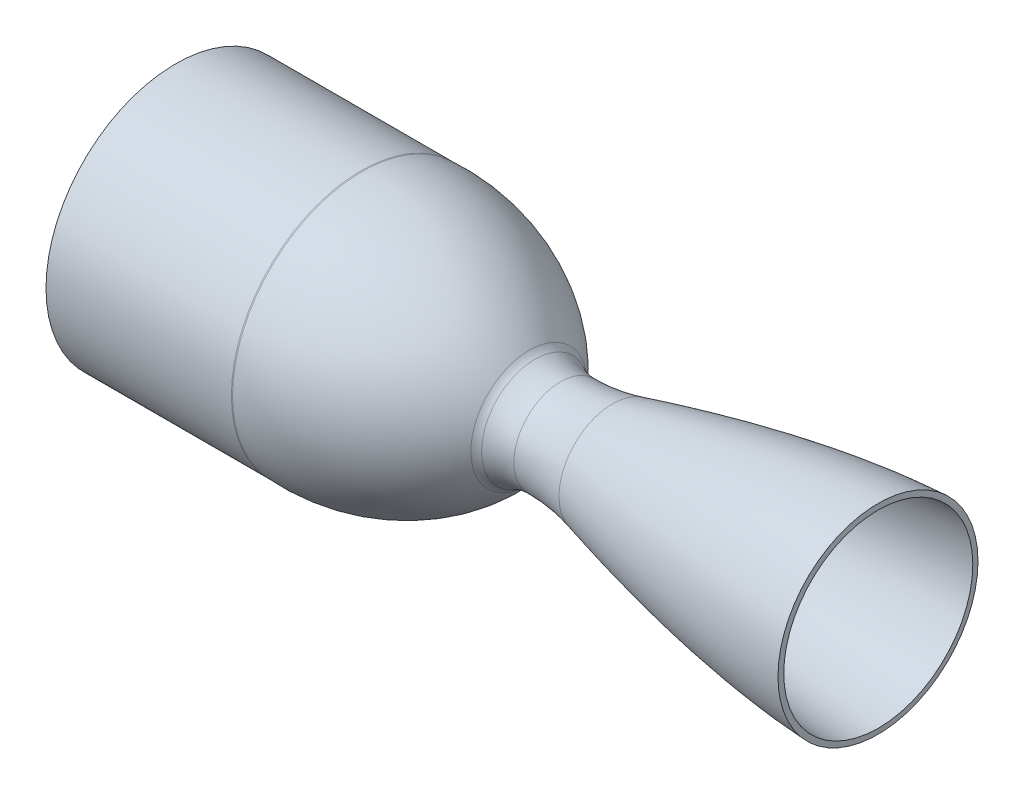
ISO-10303-21;
HEADER;
FILE_DESCRIPTION(('STEP AP214'),'2;1');
FILE_NAME('part.step','',(''),(''),'','','');
FILE_SCHEMA(('AUTOMOTIVE_DESIGN { 1 0 10303 214 1 1 1 1 }'));
ENDSEC;
DATA;
#1=APPLICATION_CONTEXT('core data for automotive mechanical design processes');
#2=APPLICATION_PROTOCOL_DEFINITION('international standard','automotive_design',2000,#1);
#3=PRODUCT_CONTEXT('',#1,'mechanical');
#4=PRODUCT('Part','Part','',(#3));
#5=PRODUCT_RELATED_PRODUCT_CATEGORY('part','',(#4));
#6=PRODUCT_DEFINITION_FORMATION('','',#4);
#7=PRODUCT_DEFINITION_CONTEXT('part definition',#1,'design');
#8=PRODUCT_DEFINITION('design','',#6,#7);
#9=PRODUCT_DEFINITION_SHAPE('','',#8);
#10=(LENGTH_UNIT() NAMED_UNIT(*) SI_UNIT(.MILLI.,.METRE.));
#11=(NAMED_UNIT(*) PLANE_ANGLE_UNIT() SI_UNIT($,.RADIAN.));
#12=(NAMED_UNIT(*) SI_UNIT($,.STERADIAN.) SOLID_ANGLE_UNIT());
#13=UNCERTAINTY_MEASURE_WITH_UNIT(LENGTH_MEASURE(1.E-05),#10,'distance_accuracy_value','');
#14=(GEOMETRIC_REPRESENTATION_CONTEXT(3) GLOBAL_UNCERTAINTY_ASSIGNED_CONTEXT((#13)) GLOBAL_UNIT_ASSIGNED_CONTEXT((#10,
#11,#12)) REPRESENTATION_CONTEXT('',''));
#15=CARTESIAN_POINT('',(0.,0.,0.));
#16=DIRECTION('',(0.,0.,1.));
#17=DIRECTION('',(1.,0.,0.));
#18=AXIS2_PLACEMENT_3D('',#15,#16,#17);
#19=CARTESIAN_POINT('',(-736444.450347794,-676144.333935307,0.));
#20=CARTESIAN_POINT('',(727603.999649895,686486.956830813,0.));
#21=CARTESIAN_POINT('',(-716935.87650445,-696808.5447579,0.));
#22=B_SPLINE_CURVE_WITH_KNOTS('',2,(#19,#20,#21),.UNSPECIFIED.,.F.,.F.,(3,3),(0.,1.),.UNSPECIFIED.);
#23=CARTESIAN_POINT('',(0.,0.,0.));
#24=DIRECTION('',(-1.,0.,0.));
#25=AXIS1_PLACEMENT('',#23,#24);
#26=SURFACE_OF_REVOLUTION('',#22,#25);
#27=CARTESIAN_POINT('',(324.509999800772,0.,0.));
#28=DIRECTION('',(-1.,0.,0.));
#29=DIRECTION('',(0.,0.,1.));
#30=AXIS2_PLACEMENT_3D('',#27,#28,#29);
#31=CIRCLE('',#30,43.6549999896754);
#32=CARTESIAN_POINT('',(324.509999800772,0.,43.6549999896754));
#33=VERTEX_POINT('',#32);
#34=EDGE_CURVE('E71',#33,#33,#31,.T.);
#35=ORIENTED_EDGE('',*,*,#34,.F.);
#36=EDGE_LOOP('',(#35));
#37=FACE_BOUND('',#36,.T.);
#38=CARTESIAN_POINT('',(202.45251404606,0.,0.));
#39=DIRECTION('',(-1.,0.,0.));
#40=DIRECTION('',(0.,0.,1.));
#41=AXIS2_PLACEMENT_3D('',#38,#39,#40);
#42=CIRCLE('',#41,22.2955650459856);
#43=CARTESIAN_POINT('',(202.45251404606,0.,22.2955650459856));
#44=VERTEX_POINT('',#43);
#45=EDGE_CURVE('E92',#44,#44,#42,.T.);
#46=ORIENTED_EDGE('',*,*,#45,.T.);
#47=EDGE_LOOP('',(#46));
#48=FACE_BOUND('',#47,.T.);
#49=ADVANCED_FACE('F39',(#37,#48),#26,.T.);
#50=CARTESIAN_POINT('',(324.377066470527,0.,0.));
#51=DIRECTION('',(-1.,0.,0.));
#52=DIRECTION('',(0.,0.,1.));
#53=AXIS2_PLACEMENT_3D('',#50,#51,#52);
#54=CONICAL_SURFACE('',#53,46.1915190078708,1.51843644868769);
#55=ORIENTED_EDGE('',*,*,#34,.T.);
#56=EDGE_LOOP('',(#55));
#57=FACE_BOUND('',#56,.T.);
#58=CARTESIAN_POINT('',(324.377066470527,0.,0.));
#59=DIRECTION('',(-1.,0.,0.));
#60=DIRECTION('',(0.,0.,1.));
#61=AXIS2_PLACEMENT_3D('',#58,#59,#60);
#62=CIRCLE('',#61,46.1915190078708);
#63=CARTESIAN_POINT('',(324.377066470527,0.,46.1915190078708));
#64=VERTEX_POINT('',#63);
#65=EDGE_CURVE('E74',#64,#64,#62,.T.);
#66=ORIENTED_EDGE('',*,*,#65,.F.);
#67=EDGE_LOOP('',(#66));
#68=FACE_BOUND('',#67,.T.);
#69=ADVANCED_FACE('F111',(#57,#68),#54,.T.);
#70=CARTESIAN_POINT('',(201.795113671454,24.7490166448509,0.));
#71=CARTESIAN_POINT('',(248.199168136411,37.1829455642607,0.));
#72=CARTESIAN_POINT('',(289.045074427709,44.339847748237,0.));
#73=CARTESIAN_POINT('',(324.377066470511,46.1915190078468,0.));
#74=B_SPLINE_CURVE_WITH_KNOTS('',3,(#70,#71,#72,#73),.UNSPECIFIED.,.F.,.F.,(4,4),(0.,1.),.UNSPECIFIED.);
#75=CARTESIAN_POINT('',(0.,0.,0.));
#76=DIRECTION('',(-1.,0.,0.));
#77=AXIS1_PLACEMENT('',#75,#76);
#78=SURFACE_OF_REVOLUTION('',#74,#77);
#79=ORIENTED_EDGE('',*,*,#65,.T.);
#80=EDGE_LOOP('',(#79));
#81=FACE_BOUND('',#80,.T.);
#82=CARTESIAN_POINT('',(201.795113671498,0.,0.));
#83=DIRECTION('',(-1.,0.,0.));
#84=DIRECTION('',(0.,0.,1.));
#85=AXIS2_PLACEMENT_3D('',#82,#83,#84);
#86=CIRCLE('',#85,24.7490166447595);
#87=CARTESIAN_POINT('',(201.795113671498,0.,24.7490166447595));
#88=VERTEX_POINT('',#87);
#89=EDGE_CURVE('E77',#88,#88,#86,.T.);
#90=ORIENTED_EDGE('',*,*,#89,.F.);
#91=EDGE_LOOP('',(#90));
#92=FACE_BOUND('',#91,.T.);
#93=ADVANCED_FACE('F106',(#81,#92),#78,.F.);
#94=CARTESIAN_POINT('',(177.8,0.,0.));
#95=DIRECTION('',(-1.,0.,0.));
#96=DIRECTION('',(0.,0.,1.));
#97=AXIS2_PLACEMENT_3D('',#94,#95,#96);
#98=TOROIDAL_SURFACE('',#97,114.3,92.709999999993);
#99=ORIENTED_EDGE('',*,*,#89,.T.);
#100=EDGE_LOOP('',(#99));
#101=FACE_BOUND('',#100,.T.);
#102=CARTESIAN_POINT('',(177.8,0.,0.));
#103=DIRECTION('',(-1.,0.,0.));
#104=DIRECTION('',(0.,0.,1.));
#105=AXIS2_PLACEMENT_3D('',#102,#103,#104);
#106=CIRCLE('',#105,21.590000000007);
#107=CARTESIAN_POINT('',(177.8,0.,21.590000000007));
#108=VERTEX_POINT('',#107);
#109=EDGE_CURVE('E80',#108,#108,#106,.T.);
#110=ORIENTED_EDGE('',*,*,#109,.F.);
#111=EDGE_LOOP('',(#110));
#112=FACE_BOUND('',#111,.T.);
#113=ADVANCED_FACE('F110',(#101,#112),#98,.F.);
#114=CARTESIAN_POINT('',(177.8,0.,0.));
#115=DIRECTION('',(-1.,0.,0.));
#116=DIRECTION('',(0.,0.,1.));
#117=AXIS2_PLACEMENT_3D('',#114,#115,#116);
#118=TOROIDAL_SURFACE('',#117,45.72,24.13);
#119=CARTESIAN_POINT('',(165.980003729655,0.,0.));
#120=DIRECTION('',(1.,0.,0.));
#121=DIRECTION('',(0.,0.,-1.));
#122=AXIS2_PLACEMENT_3D('',#119,#120,#121);
#123=CIRCLE('',#122,24.6832562365506);
#124=CARTESIAN_POINT('',(165.980003729655,0.,-24.6832562365506));
#125=VERTEX_POINT('',#124);
#126=EDGE_CURVE('E59',#125,#125,#123,.T.);
#127=ORIENTED_EDGE('',*,*,#126,.T.);
#128=EDGE_LOOP('',(#127));
#129=FACE_BOUND('',#128,.T.);
#130=ORIENTED_EDGE('',*,*,#109,.T.);
#131=EDGE_LOOP('',(#130));
#132=FACE_BOUND('',#131,.T.);
#133=ADVANCED_FACE('F164',(#129,#132),#118,.F.);
#134=CARTESIAN_POINT('',(91.409629348149,0.,0.));
#135=DIRECTION('',(-1.,0.,0.));
#136=DIRECTION('',(0.,0.,1.));
#137=AXIS2_PLACEMENT_3D('',#134,#135,#136);
#138=DEGENERATE_TOROIDAL_SURFACE('',#137,34.5200463395323,94.54,.F.);
#139=CARTESIAN_POINT('',(86.1655102225416,0.,0.));
#140=DIRECTION('',(1.,0.,0.));
#141=DIRECTION('',(0.,0.,-1.));
#142=AXIS2_PLACEMENT_3D('',#139,#140,#141);
#143=CIRCLE('',#142,59.8743963708119);
#144=CARTESIAN_POINT('',(86.1655102225416,0.,-59.8743963708119));
#145=VERTEX_POINT('',#144);
#146=EDGE_CURVE('E62',#145,#145,#143,.T.);
#147=ORIENTED_EDGE('',*,*,#146,.T.);
#148=EDGE_LOOP('',(#147));
#149=FACE_BOUND('',#148,.T.);
#150=CARTESIAN_POINT('',(163.276704955156,0.,0.));
#151=DIRECTION('',(-1.,0.,0.));
#152=DIRECTION('',(0.,0.,1.));
#153=AXIS2_PLACEMENT_3D('',#150,#151,#152);
#154=CIRCLE('',#153,26.9041756229542);
#155=CARTESIAN_POINT('',(163.276704955156,0.,26.9041756229542));
#156=VERTEX_POINT('',#155);
#157=EDGE_CURVE('E65',#156,#156,#154,.T.);
#158=ORIENTED_EDGE('',*,*,#157,.T.);
#159=EDGE_LOOP('',(#158));
#160=FACE_BOUND('',#159,.T.);
#161=ADVANCED_FACE('F161',(#149,#160),#138,.F.);
#162=CARTESIAN_POINT('',(0.,0.,0.));
#163=DIRECTION('',(-1.,0.,0.));
#164=DIRECTION('',(0.,0.,1.));
#165=AXIS2_PLACEMENT_3D('',#162,#163,#164);
#166=CYLINDRICAL_SURFACE('',#165,59.859);
#167=CARTESIAN_POINT('',(85.6108117747304,0.,0.));
#168=DIRECTION('',(-1.,0.,0.));
#169=DIRECTION('',(0.,0.,1.));
#170=AXIS2_PLACEMENT_3D('',#167,#168,#169);
#171=CIRCLE('',#170,59.859);
#172=CARTESIAN_POINT('',(85.6108117747304,0.,59.859));
#173=VERTEX_POINT('',#172);
#174=EDGE_CURVE('E68',#173,#173,#171,.T.);
#175=ORIENTED_EDGE('',*,*,#174,.T.);
#176=EDGE_LOOP('',(#175));
#177=FACE_BOUND('',#176,.T.);
#178=CARTESIAN_POINT('',(0.,0.,0.));
#179=DIRECTION('',(-1.,0.,0.));
#180=DIRECTION('',(0.,0.,1.));
#181=AXIS2_PLACEMENT_3D('',#178,#179,#180);
#182=CIRCLE('',#181,59.859);
#183=CARTESIAN_POINT('',(0.,0.,59.859));
#184=VERTEX_POINT('',#183);
#185=EDGE_CURVE('E83',#184,#184,#182,.T.);
#186=ORIENTED_EDGE('',*,*,#185,.F.);
#187=EDGE_LOOP('',(#186));
#188=FACE_BOUND('',#187,.T.);
#189=ADVANCED_FACE('F157',(#177,#188),#166,.T.);
#190=CARTESIAN_POINT('',(0.,57.319,0.));
#191=DIRECTION('',(-1.,0.,0.));
#192=DIRECTION('',(0.,0.,1.));
#193=AXIS2_PLACEMENT_3D('',#190,#191,#192);
#194=PLANE('',#193);
#195=ORIENTED_EDGE('',*,*,#185,.T.);
#196=EDGE_LOOP('',(#195));
#197=FACE_BOUND('',#196,.T.);
#198=CARTESIAN_POINT('',(0.,0.,0.));
#199=DIRECTION('',(-1.,0.,0.));
#200=DIRECTION('',(0.,0.,1.));
#201=AXIS2_PLACEMENT_3D('',#198,#199,#200);
#202=CIRCLE('',#201,57.319);
#203=CARTESIAN_POINT('',(0.,0.,57.319));
#204=VERTEX_POINT('',#203);
#205=EDGE_CURVE('E86',#204,#204,#202,.T.);
#206=ORIENTED_EDGE('',*,*,#205,.F.);
#207=EDGE_LOOP('',(#206));
#208=FACE_BOUND('',#207,.T.);
#209=ADVANCED_FACE('F151',(#197,#208),#194,.T.);
#210=CARTESIAN_POINT('',(0.,0.,0.));
#211=DIRECTION('',(-1.,0.,0.));
#212=DIRECTION('',(0.,0.,1.));
#213=AXIS2_PLACEMENT_3D('',#210,#211,#212);
#214=CYLINDRICAL_SURFACE('',#213,57.319);
#215=CARTESIAN_POINT('',(85.6817466106433,0.,0.));
#216=DIRECTION('',(1.,0.,0.));
#217=DIRECTION('',(0.,0.,-1.));
#218=AXIS2_PLACEMENT_3D('',#215,#216,#217);
#219=CIRCLE('',#218,57.319);
#220=CARTESIAN_POINT('',(85.6817466106433,0.,-57.319));
#221=VERTEX_POINT('',#220);
#222=EDGE_CURVE('E46',#221,#221,#219,.T.);
#223=ORIENTED_EDGE('',*,*,#222,.T.);
#224=EDGE_LOOP('',(#223));
#225=FACE_BOUND('',#224,.T.);
#226=ORIENTED_EDGE('',*,*,#205,.T.);
#227=EDGE_LOOP('',(#226));
#228=FACE_BOUND('',#227,.T.);
#229=ADVANCED_FACE('F143',(#225,#228),#214,.F.);
#230=CARTESIAN_POINT('',(91.409629348149,0.,0.));
#231=DIRECTION('',(-1.,0.,0.));
#232=DIRECTION('',(0.,0.,1.));
#233=AXIS2_PLACEMENT_3D('',#230,#231,#232);
#234=DEGENERATE_TOROIDAL_SURFACE('',#233,34.5200463395323,92.,.F.);
#235=CARTESIAN_POINT('',(86.2433037417713,0.,0.));
#236=DIRECTION('',(1.,0.,0.));
#237=DIRECTION('',(0.,0.,-1.));
#238=AXIS2_PLACEMENT_3D('',#235,#236,#237);
#239=CIRCLE('',#238,57.334779770634);
#240=CARTESIAN_POINT('',(86.2433037417713,0.,-57.334779770634));
#241=VERTEX_POINT('',#240);
#242=EDGE_CURVE('E50',#241,#241,#239,.F.);
#243=ORIENTED_EDGE('',*,*,#242,.T.);
#244=EDGE_LOOP('',(#243));
#245=FACE_BOUND('',#244,.T.);
#246=CARTESIAN_POINT('',(161.59687717543,0.,0.));
#247=DIRECTION('',(-1.,0.,0.));
#248=DIRECTION('',(0.,0.,1.));
#249=AXIS2_PLACEMENT_3D('',#246,#247,#248);
#250=CIRCLE('',#249,24.9589435849094);
#251=CARTESIAN_POINT('',(161.59687717543,0.,24.9589435849094));
#252=VERTEX_POINT('',#251);
#253=EDGE_CURVE('E54',#252,#252,#250,.F.);
#254=ORIENTED_EDGE('',*,*,#253,.T.);
#255=EDGE_LOOP('',(#254));
#256=FACE_BOUND('',#255,.T.);
#257=ADVANCED_FACE('F139',(#245,#256),#234,.T.);
#258=CARTESIAN_POINT('',(177.8,0.,0.));
#259=DIRECTION('',(-1.,0.,0.));
#260=DIRECTION('',(0.,0.,1.));
#261=AXIS2_PLACEMENT_3D('',#258,#259,#260);
#262=TOROIDAL_SURFACE('',#261,45.72,26.67);
#263=CARTESIAN_POINT('',(164.082510046854,0.,0.));
#264=DIRECTION('',(1.,0.,0.));
#265=DIRECTION('',(0.,0.,-1.));
#266=AXIS2_PLACEMENT_3D('',#263,#264,#265);
#267=CIRCLE('',#266,22.8481970674511);
#268=CARTESIAN_POINT('',(164.082510046854,0.,-22.8481970674511));
#269=VERTEX_POINT('',#268);
#270=EDGE_CURVE('E10',#269,#269,#267,.F.);
#271=ORIENTED_EDGE('',*,*,#270,.T.);
#272=EDGE_LOOP('',(#271));
#273=FACE_BOUND('',#272,.T.);
#274=CARTESIAN_POINT('',(177.8,0.,0.));
#275=DIRECTION('',(-1.,0.,0.));
#276=DIRECTION('',(0.,0.,1.));
#277=AXIS2_PLACEMENT_3D('',#274,#275,#276);
#278=CIRCLE('',#277,19.05);
#279=CARTESIAN_POINT('',(177.8,0.,19.05));
#280=VERTEX_POINT('',#279);
#281=EDGE_CURVE('E89',#280,#280,#278,.T.);
#282=ORIENTED_EDGE('',*,*,#281,.F.);
#283=EDGE_LOOP('',(#282));
#284=FACE_BOUND('',#283,.T.);
#285=ADVANCED_FACE('F142',(#273,#284),#262,.T.);
#286=CARTESIAN_POINT('',(177.8,0.,0.));
#287=DIRECTION('',(-1.,0.,0.));
#288=DIRECTION('',(0.,0.,1.));
#289=AXIS2_PLACEMENT_3D('',#286,#287,#288);
#290=TOROIDAL_SURFACE('',#289,114.3,95.249999999993);
#291=ORIENTED_EDGE('',*,*,#45,.F.);
#292=EDGE_LOOP('',(#291));
#293=FACE_BOUND('',#292,.T.);
#294=ORIENTED_EDGE('',*,*,#281,.T.);
#295=EDGE_LOOP('',(#294));
#296=FACE_BOUND('',#295,.T.);
#297=ADVANCED_FACE('F124',(#293,#296),#290,.T.);
#298=CARTESIAN_POINT('',(85.6108117747304,0.,0.));
#299=DIRECTION('',(-1.,0.,0.));
#300=DIRECTION('',(0.,0.,1.));
#301=AXIS2_PLACEMENT_3D('',#298,#299,#300);
#302=TOROIDAL_SURFACE('',#301,69.859,10.);
#303=ORIENTED_EDGE('',*,*,#146,.F.);
#304=EDGE_LOOP('',(#303));
#305=FACE_BOUND('',#304,.T.);
#306=ORIENTED_EDGE('',*,*,#174,.F.);
#307=EDGE_LOOP('',(#306));
#308=FACE_BOUND('',#307,.T.);
#309=ADVANCED_FACE('F120',(#305,#308),#302,.F.);
#310=CARTESIAN_POINT('',(170.878468823043,0.,0.));
#311=DIRECTION('',(-1.,0.,0.));
#312=DIRECTION('',(0.,0.,1.));
#313=AXIS2_PLACEMENT_3D('',#310,#311,#312);
#314=TOROIDAL_SURFACE('',#313,33.401343167114,10.);
#315=ORIENTED_EDGE('',*,*,#126,.F.);
#316=EDGE_LOOP('',(#315));
#317=FACE_BOUND('',#316,.T.);
#318=ORIENTED_EDGE('',*,*,#157,.F.);
#319=EDGE_LOOP('',(#318));
#320=FACE_BOUND('',#319,.T.);
#321=ADVANCED_FACE('F123',(#317,#320),#314,.F.);
#322=CARTESIAN_POINT('',(85.6817466106433,0.,0.));
#323=DIRECTION('',(1.,0.,0.));
#324=DIRECTION('',(0.,0.,-1.));
#325=AXIS2_PLACEMENT_3D('',#322,#323,#324);
#326=TOROIDAL_SURFACE('',#325,67.319,10.);
#327=ORIENTED_EDGE('',*,*,#222,.F.);
#328=EDGE_LOOP('',(#327));
#329=FACE_BOUND('',#328,.T.);
#330=ORIENTED_EDGE('',*,*,#242,.F.);
#331=EDGE_LOOP('',(#330));
#332=FACE_BOUND('',#331,.T.);
#333=ADVANCED_FACE('F127',(#329,#332),#326,.T.);
#334=CARTESIAN_POINT('',(169.225925852308,0.,0.));
#335=DIRECTION('',(1.,0.,0.));
#336=DIRECTION('',(0.,0.,-1.));
#337=AXIS2_PLACEMENT_3D('',#334,#335,#336);
#338=TOROIDAL_SURFACE('',#337,31.4240511853922,10.);
#339=ORIENTED_EDGE('',*,*,#253,.F.);
#340=EDGE_LOOP('',(#339));
#341=FACE_BOUND('',#340,.T.);
#342=ORIENTED_EDGE('',*,*,#270,.F.);
#343=EDGE_LOOP('',(#342));
#344=FACE_BOUND('',#343,.T.);
#345=ADVANCED_FACE('F41',(#341,#344),#338,.T.);
#346=CLOSED_SHELL('',(#49,#69,#93,#113,#133,#161,#189,#209,#229,#257,#285,#297,#309,#321,#333,#345));
#347=MANIFOLD_SOLID_BREP('B2',#346);
#348=ADVANCED_BREP_SHAPE_REPRESENTATION('',(#18,#347),#14);
#349=SHAPE_DEFINITION_REPRESENTATION(#9,#348);
ENDSEC;
END-ISO-10303-21;
